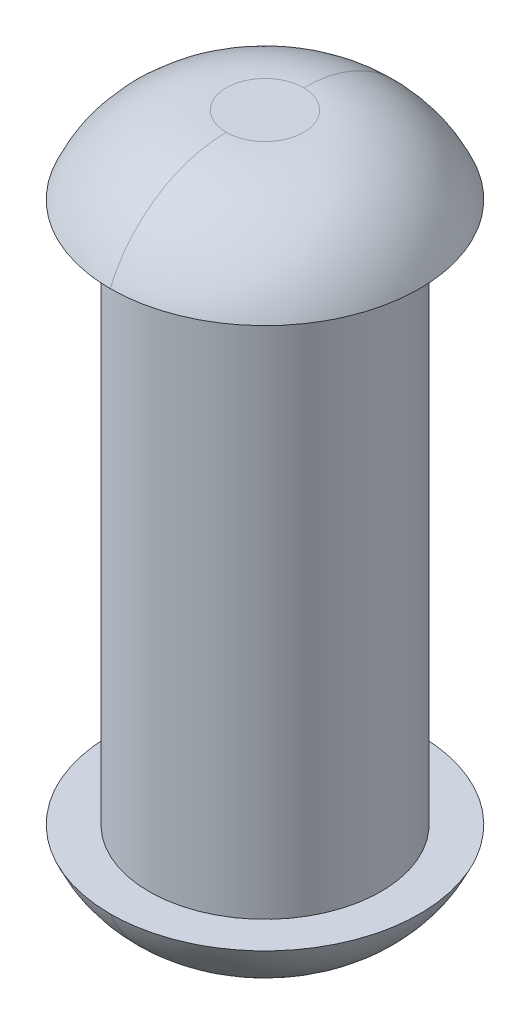
ISO-10303-21;
HEADER;
FILE_DESCRIPTION(('STEP AP214'),'2;1');
FILE_NAME('part.step','',(''),(''),'','','');
FILE_SCHEMA(('AUTOMOTIVE_DESIGN { 1 0 10303 214 1 1 1 1 }'));
ENDSEC;
DATA;
#1=APPLICATION_CONTEXT('core data for automotive mechanical design processes');
#2=APPLICATION_PROTOCOL_DEFINITION('international standard','automotive_design',2000,#1);
#3=PRODUCT_CONTEXT('',#1,'mechanical');
#4=PRODUCT('Part','Part','',(#3));
#5=PRODUCT_RELATED_PRODUCT_CATEGORY('part','',(#4));
#6=PRODUCT_DEFINITION_FORMATION('','',#4);
#7=PRODUCT_DEFINITION_CONTEXT('part definition',#1,'design');
#8=PRODUCT_DEFINITION('design','',#6,#7);
#9=PRODUCT_DEFINITION_SHAPE('','',#8);
#10=(LENGTH_UNIT() NAMED_UNIT(*) SI_UNIT(.MILLI.,.METRE.));
#11=(NAMED_UNIT(*) PLANE_ANGLE_UNIT() SI_UNIT($,.RADIAN.));
#12=(NAMED_UNIT(*) SI_UNIT($,.STERADIAN.) SOLID_ANGLE_UNIT());
#13=UNCERTAINTY_MEASURE_WITH_UNIT(LENGTH_MEASURE(1.E-05),#10,'distance_accuracy_value','');
#14=(GEOMETRIC_REPRESENTATION_CONTEXT(3) GLOBAL_UNCERTAINTY_ASSIGNED_CONTEXT((#13)) GLOBAL_UNIT_ASSIGNED_CONTEXT((#10,
#11,#12)) REPRESENTATION_CONTEXT('',''));
#15=CARTESIAN_POINT('',(0.,0.,0.));
#16=DIRECTION('',(0.,0.,1.));
#17=DIRECTION('',(1.,0.,0.));
#18=AXIS2_PLACEMENT_3D('',#15,#16,#17);
#19=CARTESIAN_POINT('',(-0.506,4.5,0.506));
#20=DIRECTION('',(0.,-1.,0.));
#21=DIRECTION('',(0.,0.,-1.));
#22=AXIS2_PLACEMENT_3D('',#19,#20,#21);
#23=PLANE('',#22);
#24=CARTESIAN_POINT('',(0.,4.5,0.500000000000116));
#25=CARTESIAN_POINT('',(-1.00000000000023,4.5,0.500000000000115));
#26=CARTESIAN_POINT('',(-1.00000000000023,4.5,-0.500000000000115));
#27=CARTESIAN_POINT('',(0.,4.5,-0.500000000000116));
#28=(BOUNDED_CURVE() B_SPLINE_CURVE(3,(#24,#25,#26,#27),.UNSPECIFIED.,.F.,
.F.) B_SPLINE_CURVE_WITH_KNOTS((4,4),(0.,1.),
.UNSPECIFIED.) CURVE() GEOMETRIC_REPRESENTATION_ITEM() RATIONAL_B_SPLINE_CURVE((0.999999999999978,
0.333333333333326,0.333333333333326,0.999999999999978)) REPRESENTATION_ITEM(''));
#29=CARTESIAN_POINT('',(0.,4.5,0.4999999999008));
#30=VERTEX_POINT('',#29);
#31=CARTESIAN_POINT('',(0.,4.5,-0.4999999999008));
#32=VERTEX_POINT('',#31);
#33=EDGE_CURVE('E70',#30,#32,#28,.T.);
#34=ORIENTED_EDGE('',*,*,#33,.F.);
#35=CARTESIAN_POINT('',(0.,4.5,-0.500000000000116));
#36=CARTESIAN_POINT('',(1.00000000000023,4.5,-0.500000000000115));
#37=CARTESIAN_POINT('',(1.00000000000023,4.5,0.500000000000115));
#38=CARTESIAN_POINT('',(0.,4.5,0.500000000000116));
#39=(BOUNDED_CURVE() B_SPLINE_CURVE(3,(#35,#36,#37,#38),.UNSPECIFIED.,.F.,
.F.) B_SPLINE_CURVE_WITH_KNOTS((4,4),(0.,1.),
.UNSPECIFIED.) CURVE() GEOMETRIC_REPRESENTATION_ITEM() RATIONAL_B_SPLINE_CURVE((0.999999999999978,
0.333333333333326,0.333333333333326,0.999999999999978)) REPRESENTATION_ITEM(''));
#40=EDGE_CURVE('E74',#32,#30,#39,.T.);
#41=ORIENTED_EDGE('',*,*,#40,.F.);
#42=EDGE_LOOP('',(#34,#41));
#43=FACE_BOUND('',#42,.T.);
#44=ADVANCED_FACE('F17',(#43),#23,.F.);
#45=CARTESIAN_POINT('',(-0.506,-4.5,-0.506));
#46=DIRECTION('',(0.,1.,0.));
#47=DIRECTION('',(0.,0.,1.));
#48=AXIS2_PLACEMENT_3D('',#45,#46,#47);
#49=PLANE('',#48);
#50=CARTESIAN_POINT('',(0.,-4.5,-0.500000000000116));
#51=CARTESIAN_POINT('',(-1.00000000000023,-4.5,-0.500000000000116));
#52=CARTESIAN_POINT('',(-1.00000000000023,-4.5,0.500000000000116));
#53=CARTESIAN_POINT('',(0.,-4.5,0.500000000000116));
#54=(BOUNDED_CURVE() B_SPLINE_CURVE(3,(#50,#51,#52,#53),.UNSPECIFIED.,.F.,
.F.) B_SPLINE_CURVE_WITH_KNOTS((4,4),(0.,1.),
.UNSPECIFIED.) CURVE() GEOMETRIC_REPRESENTATION_ITEM() RATIONAL_B_SPLINE_CURVE((0.999999999999978,
0.333333333333326,0.333333333333326,0.999999999999978)) REPRESENTATION_ITEM(''));
#55=CARTESIAN_POINT('',(0.,-4.5,-0.4999999999008));
#56=VERTEX_POINT('',#55);
#57=CARTESIAN_POINT('',(0.,-4.5,0.4999999999008));
#58=VERTEX_POINT('',#57);
#59=EDGE_CURVE('E61',#56,#58,#54,.T.);
#60=ORIENTED_EDGE('',*,*,#59,.F.);
#61=CARTESIAN_POINT('',(0.,-4.5,0.500000000000116));
#62=CARTESIAN_POINT('',(1.00000000000023,-4.5,0.500000000000116));
#63=CARTESIAN_POINT('',(1.00000000000023,-4.5,-0.500000000000116));
#64=CARTESIAN_POINT('',(0.,-4.5,-0.500000000000116));
#65=(BOUNDED_CURVE() B_SPLINE_CURVE(3,(#61,#62,#63,#64),.UNSPECIFIED.,.F.,
.F.) B_SPLINE_CURVE_WITH_KNOTS((4,4),(0.,1.),
.UNSPECIFIED.) CURVE() GEOMETRIC_REPRESENTATION_ITEM() RATIONAL_B_SPLINE_CURVE((0.999999999999978,
0.333333333333326,0.333333333333326,0.999999999999978)) REPRESENTATION_ITEM(''));
#66=EDGE_CURVE('E191',#58,#56,#65,.T.);
#67=ORIENTED_EDGE('',*,*,#66,.F.);
#68=EDGE_LOOP('',(#60,#67));
#69=FACE_BOUND('',#68,.T.);
#70=ADVANCED_FACE('F138',(#69),#49,.F.);
#71=CARTESIAN_POINT('',(0.,4.5,-0.5));
#72=CARTESIAN_POINT('',(-1.,4.5,-0.5));
#73=CARTESIAN_POINT('',(-1.,4.5,0.5));
#74=CARTESIAN_POINT('',(0.,4.5,0.5));
#75=CARTESIAN_POINT('',(0.,4.5,-1.176692031));
#76=CARTESIAN_POINT('',(-2.353384062,4.5,-1.176692031));
#77=CARTESIAN_POINT('',(-2.353384062,4.5,1.176692031));
#78=CARTESIAN_POINT('',(0.,4.5,1.176692031));
#79=CARTESIAN_POINT('',(0.,4.124638798,-1.739733834));
#80=CARTESIAN_POINT('',(-3.479467669,4.124638798,-1.739733834));
#81=CARTESIAN_POINT('',(-3.479467669,4.124638798,1.739733834));
#82=CARTESIAN_POINT('',(0.,4.124638798,1.739733834));
#83=CARTESIAN_POINT('',(0.,3.5,-2.));
#84=CARTESIAN_POINT('',(-4.,3.5,-2.));
#85=CARTESIAN_POINT('',(-4.,3.5,2.));
#86=CARTESIAN_POINT('',(0.,3.5,2.));
#87=(BOUNDED_SURFACE() B_SPLINE_SURFACE(3,3,((#71,#72,#73,#74),(#75,#76,#77,#78),(#79,#80,#81,
#82),(#83,#84,#85,#86)),.UNSPECIFIED.,.F.,.F.,.F.) B_SPLINE_SURFACE_WITH_KNOTS((4,4),(4,4),(0.,
1.),(0.,1.),.UNSPECIFIED.) GEOMETRIC_REPRESENTATION_ITEM() RATIONAL_B_SPLINE_SURFACE(((1.,
0.333333333333333,0.333333333333333,1.),(0.888033529558563,0.296011176519521,0.296011176519521,
0.888033529558563),(0.888033529558563,0.296011176519521,0.296011176519521,0.888033529558563),
(1.,0.333333333333333,0.333333333333333,1.))) REPRESENTATION_ITEM('') SURFACE());
#88=CARTESIAN_POINT('',(0.,4.5,0.5));
#89=CARTESIAN_POINT('',(0.,4.5,1.176692031));
#90=CARTESIAN_POINT('',(0.,4.124638798,1.739733834));
#91=CARTESIAN_POINT('',(0.,3.5,2.));
#92=(BOUNDED_CURVE() B_SPLINE_CURVE(3,(#88,#89,#90,#91),.UNSPECIFIED.,.F.,
.F.) B_SPLINE_CURVE_WITH_KNOTS((4,4),(0.,1.),
.UNSPECIFIED.) CURVE() GEOMETRIC_REPRESENTATION_ITEM() RATIONAL_B_SPLINE_CURVE((1.,
0.888033529558563,0.888033529558563,1.)) REPRESENTATION_ITEM(''));
#93=CARTESIAN_POINT('',(0.,3.5,2.));
#94=VERTEX_POINT('',#93);
#95=EDGE_CURVE('E80',#30,#94,#92,.T.);
#96=CARTESIAN_POINT('',(0.,4.5,-0.5));
#97=CARTESIAN_POINT('',(0.,4.5,-1.176692031));
#98=CARTESIAN_POINT('',(0.,4.124638798,-1.739733834));
#99=CARTESIAN_POINT('',(0.,3.5,-2.));
#100=(BOUNDED_CURVE() B_SPLINE_CURVE(3,(#96,#97,#98,#99),.UNSPECIFIED.,.F.,
.F.) B_SPLINE_CURVE_WITH_KNOTS((4,4),(0.,1.),
.UNSPECIFIED.) CURVE() GEOMETRIC_REPRESENTATION_ITEM() RATIONAL_B_SPLINE_CURVE((1.,
0.888033529558563,0.888033529558563,1.)) REPRESENTATION_ITEM(''));
#101=CARTESIAN_POINT('',(0.,3.5,-2.));
#102=VERTEX_POINT('',#101);
#103=EDGE_CURVE('E53',#102,#32,#100,.F.);
#104=CARTESIAN_POINT('',(0.,3.5,-2.));
#105=CARTESIAN_POINT('',(-0.0562680229619233,3.5,-1.99999962641447));
#106=CARTESIAN_POINT('',(-0.112509087930597,3.5,-1.99762394300518));
#107=CARTESIAN_POINT('',(-0.224588791283825,3.5,-1.9881463739492));
#108=CARTESIAN_POINT('',(-0.28042744880788,3.5,-1.98104471460144));
#109=CARTESIAN_POINT('',(-0.446648063709757,3.5,-1.95271723958908));
#110=CARTESIAN_POINT('',(-0.555916554788709,3.5,-1.92446874657418));
#111=CARTESIAN_POINT('',(-0.76815506824914,3.5,-1.85002914799462));
#112=CARTESIAN_POINT('',(-0.871122142729098,3.5,-1.80382971785695));
#113=CARTESIAN_POINT('',(-1.06783350824989,3.5,-1.69480587148286));
#114=CARTESIAN_POINT('',(-1.16157960622734,3.5,-1.63198472136682));
#115=CARTESIAN_POINT('',(-1.33719357958562,3.5,-1.49149611993653));
#116=CARTESIAN_POINT('',(-1.41906119303309,3.5,-1.41382834132565));
#117=CARTESIAN_POINT('',(-1.56860880173396,3.5,-1.24583855555912));
#118=CARTESIAN_POINT('',(-1.63628663443956,3.5,-1.15551462307744));
#119=CARTESIAN_POINT('',(-1.75551336645388,3.5,-0.964790249798284));
#120=CARTESIAN_POINT('',(-1.80706297764236,3.5,-0.86439025400421));
#121=CARTESIAN_POINT('',(-1.89257162478123,3.5,-0.656367388949255));
#122=CARTESIAN_POINT('',(-1.92653178597954,3.5,-0.548744982224534));
#123=CARTESIAN_POINT('',(-1.97590271771947,3.5,-0.329323889979721));
#124=CARTESIAN_POINT('',(-1.99131310813408,3.5,-0.217525118924825));
#125=CARTESIAN_POINT('',(-2.00314687524351,3.5,0.0070745517049324));
#126=CARTESIAN_POINT('',(-1.99956981521806,3.5,0.119875474270177));
#127=CARTESIAN_POINT('',(-1.97352584666787,3.5,0.343277698620541));
#128=CARTESIAN_POINT('',(-1.95105912541404,3.5,0.45387902220122));
#129=CARTESIAN_POINT('',(-1.88788698181247,3.5,0.669728020212936));
#130=CARTESIAN_POINT('',(-1.84718161732594,3.5,0.774975711626934));
#131=CARTESIAN_POINT('',(-1.74863777661584,3.5,0.977189487563662));
#132=CARTESIAN_POINT('',(-1.69079885135884,3.5,1.07415535495196));
#133=CARTESIAN_POINT('',(-1.59254679176868,3.5,1.21118381531814));
#134=CARTESIAN_POINT('',(-1.55787326470221,3.5,1.25546374327093));
#135=CARTESIAN_POINT('',(-1.48488999924051,3.5,1.34099378976153));
#136=CARTESIAN_POINT('',(-1.44657678398915,3.5,1.38224094312319));
#137=CARTESIAN_POINT('',(-1.32666910931567,3.5,1.50085475444602));
#138=CARTESIAN_POINT('',(-1.2400183877163,3.5,1.57321655880106));
#139=CARTESIAN_POINT('',(-1.05578606563579,3.5,1.7023417008121));
#140=CARTESIAN_POINT('',(-0.958204881083522,3.5,1.75910563171886));
#141=CARTESIAN_POINT('',(-0.80577215545657,3.5,1.83136904197552));
#142=CARTESIAN_POINT('',(-0.753894007216332,3.5,1.85332586226793));
#143=CARTESIAN_POINT('',(-0.648500919330627,3.5,1.89277724350991));
#144=CARTESIAN_POINT('',(-0.594987344997411,3.5,1.91027541856335));
#145=CARTESIAN_POINT('',(-0.48673393323535,3.5,1.94068278370897));
#146=CARTESIAN_POINT('',(-0.431995352103913,3.5,1.95359646502991));
#147=CARTESIAN_POINT('',(-0.321635163360164,3.5,1.97476719522395));
#148=CARTESIAN_POINT('',(-0.266013819318915,3.5,1.98302560811863));
#149=CARTESIAN_POINT('',(-0.175226234050914,3.5,1.99261890883154));
#150=CARTESIAN_POINT('',(-0.140205275145586,3.5,1.99538857922048));
#151=CARTESIAN_POINT('',(-0.0701241102824074,3.5,1.99907778719133));
#152=CARTESIAN_POINT('',(-0.0350640649155604,3.5,2.0000003757604));
#153=CARTESIAN_POINT('',(0.,3.5,2.));
#154=B_SPLINE_CURVE_WITH_KNOTS('',3,(#104,#105,#106,#107,#108,#109,#110,#111,#112,#113,#114,
#115,#116,#117,#118,#119,#120,#121,#122,#123,#124,#125,#126,#127,#128,#129,#130,#131,#132,#133,
#134,#135,#136,#137,#138,#139,#140,#141,#142,#143,#144,#145,#146,#147,#148,#149,#150,#151,#152,
#153),.UNSPECIFIED.,.F.,.F.,(4,2,2,2,2,2,2,2,2,2,2,2,2,2,2,2,2,2,2,2,2,2,2,2,4),(0.,
0.168700384984718,0.337392692490236,0.674238578630679,1.01124086057954,1.34817697166002,
1.6851205114153,2.02211536469862,2.35909534134667,2.69605375774872,3.03301907907773,
3.36999215080096,3.70696188183357,4.04393054385352,4.38090803787167,4.54945707455141,
4.71816877054622,5.05514437623787,5.39210716359791,5.56093987110553,5.72963528711621,
5.89816498054248,6.06664526805524,6.1719914868906,6.27716355208919),.UNSPECIFIED.);
#155=EDGE_CURVE('E22',#102,#94,#154,.T.);
#156=ORIENTED_EDGE('',*,*,#95,.F.);
#157=ORIENTED_EDGE('',*,*,#33,.T.);
#158=ORIENTED_EDGE('',*,*,#103,.F.);
#159=ORIENTED_EDGE('',*,*,#155,.T.);
#160=EDGE_LOOP('',(#156,#157,#158,#159));
#161=FACE_BOUND('',#160,.T.);
#162=ADVANCED_FACE('F81',(#161),#87,.T.);
#163=CARTESIAN_POINT('',(0.,4.5,0.5));
#164=CARTESIAN_POINT('',(1.,4.5,0.5));
#165=CARTESIAN_POINT('',(1.,4.5,-0.5));
#166=CARTESIAN_POINT('',(0.,4.5,-0.5));
#167=CARTESIAN_POINT('',(0.,4.5,1.176692031));
#168=CARTESIAN_POINT('',(2.353384062,4.5,1.176692031));
#169=CARTESIAN_POINT('',(2.353384062,4.5,-1.176692031));
#170=CARTESIAN_POINT('',(0.,4.5,-1.176692031));
#171=CARTESIAN_POINT('',(0.,4.124638798,1.739733834));
#172=CARTESIAN_POINT('',(3.479467669,4.124638798,1.739733834));
#173=CARTESIAN_POINT('',(3.479467669,4.124638798,-1.739733834));
#174=CARTESIAN_POINT('',(0.,4.124638798,-1.739733834));
#175=CARTESIAN_POINT('',(0.,3.5,2.));
#176=CARTESIAN_POINT('',(4.,3.5,2.));
#177=CARTESIAN_POINT('',(4.,3.5,-2.));
#178=CARTESIAN_POINT('',(0.,3.5,-2.));
#179=(BOUNDED_SURFACE() B_SPLINE_SURFACE(3,3,((#163,#164,#165,#166),(#167,#168,#169,#170),(#171,
#172,#173,#174),(#175,#176,#177,#178)),.UNSPECIFIED.,.F.,.F.,
.F.) B_SPLINE_SURFACE_WITH_KNOTS((4,4),(4,4),(0.,1.),(0.,1.),
.UNSPECIFIED.) GEOMETRIC_REPRESENTATION_ITEM() RATIONAL_B_SPLINE_SURFACE(((1.,0.333333333333333,
0.333333333333333,1.),(0.888033529558563,0.296011176519521,0.296011176519521,0.888033529558563),
(0.888033529558563,0.296011176519521,0.296011176519521,0.888033529558563),(1.,0.333333333333333,
0.333333333333333,1.))) REPRESENTATION_ITEM('') SURFACE());
#180=CARTESIAN_POINT('',(0.,3.5,2.));
#181=CARTESIAN_POINT('',(0.0562680229619233,3.5,1.99999962641447));
#182=CARTESIAN_POINT('',(0.112509087930597,3.5,1.99762394300518));
#183=CARTESIAN_POINT('',(0.224588791283825,3.5,1.9881463739492));
#184=CARTESIAN_POINT('',(0.28042744880788,3.5,1.98104471460144));
#185=CARTESIAN_POINT('',(0.446648063709757,3.5,1.95271723958908));
#186=CARTESIAN_POINT('',(0.555916554788709,3.5,1.92446874657418));
#187=CARTESIAN_POINT('',(0.76815506824914,3.5,1.85002914799462));
#188=CARTESIAN_POINT('',(0.871122142729098,3.5,1.80382971785695));
#189=CARTESIAN_POINT('',(1.06783350824989,3.5,1.69480587148286));
#190=CARTESIAN_POINT('',(1.16157960622734,3.5,1.63198472136682));
#191=CARTESIAN_POINT('',(1.33719357958562,3.5,1.49149611993653));
#192=CARTESIAN_POINT('',(1.41906119303309,3.5,1.41382834132565));
#193=CARTESIAN_POINT('',(1.56860880173396,3.5,1.24583855555912));
#194=CARTESIAN_POINT('',(1.63628663443956,3.5,1.15551462307744));
#195=CARTESIAN_POINT('',(1.75551336645388,3.5,0.964790249798284));
#196=CARTESIAN_POINT('',(1.80706297764236,3.5,0.86439025400421));
#197=CARTESIAN_POINT('',(1.89257162478123,3.5,0.656367388949255));
#198=CARTESIAN_POINT('',(1.92653178597954,3.5,0.548744982224534));
#199=CARTESIAN_POINT('',(1.97590271771947,3.5,0.329323889979721));
#200=CARTESIAN_POINT('',(1.99131310813408,3.5,0.217525118924825));
#201=CARTESIAN_POINT('',(2.00314687524351,3.5,-0.0070745517049324));
#202=CARTESIAN_POINT('',(1.99956981521806,3.5,-0.119875474270177));
#203=CARTESIAN_POINT('',(1.97352584666787,3.5,-0.343277698620541));
#204=CARTESIAN_POINT('',(1.95105912541404,3.5,-0.45387902220122));
#205=CARTESIAN_POINT('',(1.88788698181247,3.5,-0.669728020212936));
#206=CARTESIAN_POINT('',(1.84718161732594,3.5,-0.774975711626934));
#207=CARTESIAN_POINT('',(1.74863777661584,3.5,-0.977189487563662));
#208=CARTESIAN_POINT('',(1.69079885135884,3.5,-1.07415535495196));
#209=CARTESIAN_POINT('',(1.59254679176868,3.5,-1.21118381531814));
#210=CARTESIAN_POINT('',(1.55787326470221,3.5,-1.25546374327093));
#211=CARTESIAN_POINT('',(1.48488999924051,3.5,-1.34099378976153));
#212=CARTESIAN_POINT('',(1.44657678398915,3.5,-1.38224094312319));
#213=CARTESIAN_POINT('',(1.32666910931567,3.5,-1.50085475444602));
#214=CARTESIAN_POINT('',(1.2400183877163,3.5,-1.57321655880106));
#215=CARTESIAN_POINT('',(1.05578606563579,3.5,-1.7023417008121));
#216=CARTESIAN_POINT('',(0.958204881083522,3.5,-1.75910563171886));
#217=CARTESIAN_POINT('',(0.80577215545657,3.5,-1.83136904197552));
#218=CARTESIAN_POINT('',(0.753894007216332,3.5,-1.85332586226793));
#219=CARTESIAN_POINT('',(0.648500919330627,3.5,-1.89277724350991));
#220=CARTESIAN_POINT('',(0.594987344997411,3.5,-1.91027541856335));
#221=CARTESIAN_POINT('',(0.48673393323535,3.5,-1.94068278370897));
#222=CARTESIAN_POINT('',(0.431995352103913,3.5,-1.95359646502991));
#223=CARTESIAN_POINT('',(0.321635163360164,3.5,-1.97476719522395));
#224=CARTESIAN_POINT('',(0.266013819318915,3.5,-1.98302560811863));
#225=CARTESIAN_POINT('',(0.175226234050914,3.5,-1.99261890883154));
#226=CARTESIAN_POINT('',(0.140205275145586,3.5,-1.99538857922048));
#227=CARTESIAN_POINT('',(0.0701241102824074,3.5,-1.99907778719133));
#228=CARTESIAN_POINT('',(0.0350640649155604,3.5,-2.0000003757604));
#229=CARTESIAN_POINT('',(0.,3.5,-2.));
#230=B_SPLINE_CURVE_WITH_KNOTS('',3,(#180,#181,#182,#183,#184,#185,#186,#187,#188,#189,#190,
#191,#192,#193,#194,#195,#196,#197,#198,#199,#200,#201,#202,#203,#204,#205,#206,#207,#208,#209,
#210,#211,#212,#213,#214,#215,#216,#217,#218,#219,#220,#221,#222,#223,#224,#225,#226,#227,#228,
#229),.UNSPECIFIED.,.F.,.F.,(4,2,2,2,2,2,2,2,2,2,2,2,2,2,2,2,2,2,2,2,2,2,2,2,4),(0.,
0.168700384984718,0.337392692490236,0.674238578630679,1.01124086057954,1.34817697166002,
1.6851205114153,2.02211536469862,2.35909534134667,2.69605375774872,3.03301907907773,
3.36999215080096,3.70696188183357,4.04393054385352,4.38090803787167,4.54945707455141,
4.71816877054622,5.05514437623787,5.39210716359791,5.56093987110553,5.72963528711621,
5.89816498054248,6.06664526805524,6.1719914868906,6.27716355208919),.UNSPECIFIED.);
#231=EDGE_CURVE('E121',#94,#102,#230,.T.);
#232=ORIENTED_EDGE('',*,*,#40,.T.);
#233=ORIENTED_EDGE('',*,*,#95,.T.);
#234=ORIENTED_EDGE('',*,*,#231,.T.);
#235=ORIENTED_EDGE('',*,*,#103,.T.);
#236=EDGE_LOOP('',(#232,#233,#234,#235));
#237=FACE_BOUND('',#236,.T.);
#238=ADVANCED_FACE('F87',(#237),#179,.T.);
#239=CARTESIAN_POINT('',(0.,-3.5,-2.));
#240=CARTESIAN_POINT('',(-4.,-3.5,-2.));
#241=CARTESIAN_POINT('',(-4.,-3.5,2.));
#242=CARTESIAN_POINT('',(0.,-3.5,2.));
#243=CARTESIAN_POINT('',(0.,-4.124638798,-1.739733834));
#244=CARTESIAN_POINT('',(-3.479467669,-4.124638798,-1.739733834));
#245=CARTESIAN_POINT('',(-3.479467669,-4.124638798,1.739733834));
#246=CARTESIAN_POINT('',(0.,-4.124638798,1.739733834));
#247=CARTESIAN_POINT('',(0.,-4.5,-1.176692031));
#248=CARTESIAN_POINT('',(-2.353384062,-4.5,-1.176692031));
#249=CARTESIAN_POINT('',(-2.353384062,-4.5,1.176692031));
#250=CARTESIAN_POINT('',(0.,-4.5,1.176692031));
#251=CARTESIAN_POINT('',(0.,-4.5,-0.5));
#252=CARTESIAN_POINT('',(-1.,-4.5,-0.5));
#253=CARTESIAN_POINT('',(-1.,-4.5,0.5));
#254=CARTESIAN_POINT('',(0.,-4.5,0.5));
#255=(BOUNDED_SURFACE() B_SPLINE_SURFACE(3,3,((#239,#240,#241,#242),(#243,#244,#245,#246),(#247,
#248,#249,#250),(#251,#252,#253,#254)),.UNSPECIFIED.,.F.,.F.,
.F.) B_SPLINE_SURFACE_WITH_KNOTS((4,4),(4,4),(0.,1.),(0.,1.),
.UNSPECIFIED.) GEOMETRIC_REPRESENTATION_ITEM() RATIONAL_B_SPLINE_SURFACE(((1.,0.333333333333333,
0.333333333333333,1.),(0.888033529558563,0.296011176519521,0.296011176519521,0.888033529558563),
(0.888033529558563,0.296011176519521,0.296011176519521,0.888033529558563),(1.,0.333333333333333,
0.333333333333333,1.))) REPRESENTATION_ITEM('') SURFACE());
#256=CARTESIAN_POINT('',(0.,-3.5,2.));
#257=CARTESIAN_POINT('',(0.,-4.124638798,1.739733834));
#258=CARTESIAN_POINT('',(0.,-4.5,1.176692031));
#259=CARTESIAN_POINT('',(0.,-4.5,0.5));
#260=(BOUNDED_CURVE() B_SPLINE_CURVE(3,(#256,#257,#258,#259),.UNSPECIFIED.,.F.,
.F.) B_SPLINE_CURVE_WITH_KNOTS((4,4),(0.,1.),
.UNSPECIFIED.) CURVE() GEOMETRIC_REPRESENTATION_ITEM() RATIONAL_B_SPLINE_CURVE((1.,
0.888033529558563,0.888033529558563,1.)) REPRESENTATION_ITEM(''));
#261=CARTESIAN_POINT('',(0.,-3.5,2.));
#262=VERTEX_POINT('',#261);
#263=EDGE_CURVE('E189',#262,#58,#260,.T.);
#264=CARTESIAN_POINT('',(0.,-3.5,2.));
#265=CARTESIAN_POINT('',(-0.0562680229619232,-3.5,1.99999962641447));
#266=CARTESIAN_POINT('',(-0.112509087930596,-3.5,1.99762394300518));
#267=CARTESIAN_POINT('',(-0.224588791283825,-3.5,1.9881463739492));
#268=CARTESIAN_POINT('',(-0.280427448807879,-3.5,1.98104471460144));
#269=CARTESIAN_POINT('',(-0.446648063709756,-3.5,1.95271723958908));
#270=CARTESIAN_POINT('',(-0.555916554788707,-3.5,1.92446874657419));
#271=CARTESIAN_POINT('',(-0.768155068249138,-3.5,1.85002914799462));
#272=CARTESIAN_POINT('',(-0.871122142729096,-3.5,1.80382971785696));
#273=CARTESIAN_POINT('',(-1.06783350824988,-3.5,1.69480587148286));
#274=CARTESIAN_POINT('',(-1.16157960622734,-3.5,1.63198472136682));
#275=CARTESIAN_POINT('',(-1.33719357958562,-3.5,1.49149611993653));
#276=CARTESIAN_POINT('',(-1.41906119303309,-3.5,1.41382834132565));
#277=CARTESIAN_POINT('',(-1.56860880173396,-3.5,1.24583855555913));
#278=CARTESIAN_POINT('',(-1.63628663443956,-3.5,1.15551462307745));
#279=CARTESIAN_POINT('',(-1.75551336645388,-3.5,0.964790249798287));
#280=CARTESIAN_POINT('',(-1.80706297764236,-3.5,0.864390254004213));
#281=CARTESIAN_POINT('',(-1.89257162478123,-3.5,0.656367388949258));
#282=CARTESIAN_POINT('',(-1.92653178597954,-3.5,0.548744982224536));
#283=CARTESIAN_POINT('',(-1.97590271771947,-3.5,0.329323889979724));
#284=CARTESIAN_POINT('',(-1.99131310813407,-3.5,0.217525118924829));
#285=CARTESIAN_POINT('',(-2.00314687524351,-3.5,-0.00707455170492855));
#286=CARTESIAN_POINT('',(-1.99956981521806,-3.5,-0.119875474270173));
#287=CARTESIAN_POINT('',(-1.97352584666787,-3.5,-0.343277698620537));
#288=CARTESIAN_POINT('',(-1.95105912541404,-3.5,-0.453879022201216));
#289=CARTESIAN_POINT('',(-1.88788698181247,-3.5,-0.669728020212933));
#290=CARTESIAN_POINT('',(-1.84718161732595,-3.5,-0.774975711626931));
#291=CARTESIAN_POINT('',(-1.74863777661584,-3.5,-0.97718948756366));
#292=CARTESIAN_POINT('',(-1.69079885135884,-3.5,-1.07415535495195));
#293=CARTESIAN_POINT('',(-1.59254679176868,-3.5,-1.21118381531814));
#294=CARTESIAN_POINT('',(-1.55787326470221,-3.5,-1.25546374327093));
#295=CARTESIAN_POINT('',(-1.48488999924051,-3.5,-1.34099378976153));
#296=CARTESIAN_POINT('',(-1.44657678398915,-3.5,-1.38224094312319));
#297=CARTESIAN_POINT('',(-1.32666910931567,-3.5,-1.50085475444602));
#298=CARTESIAN_POINT('',(-1.2400183877163,-3.5,-1.57321655880106));
#299=CARTESIAN_POINT('',(-1.05578606563579,-3.5,-1.7023417008121));
#300=CARTESIAN_POINT('',(-0.958204881083525,-3.5,-1.75910563171886));
#301=CARTESIAN_POINT('',(-0.805772155456574,-3.5,-1.83136904197552));
#302=CARTESIAN_POINT('',(-0.753894007216335,-3.5,-1.85332586226793));
#303=CARTESIAN_POINT('',(-0.648500919330631,-3.5,-1.8927772435099));
#304=CARTESIAN_POINT('',(-0.594987344997414,-3.5,-1.91027541856335));
#305=CARTESIAN_POINT('',(-0.486733933235353,-3.5,-1.94068278370897));
#306=CARTESIAN_POINT('',(-0.431995352103917,-3.5,-1.95359646502991));
#307=CARTESIAN_POINT('',(-0.321635163360168,-3.5,-1.97476719522395));
#308=CARTESIAN_POINT('',(-0.266013819318919,-3.5,-1.98302560811863));
#309=CARTESIAN_POINT('',(-0.175226234050917,-3.5,-1.99261890883154));
#310=CARTESIAN_POINT('',(-0.140205275145588,-3.5,-1.99538857922048));
#311=CARTESIAN_POINT('',(-0.0701241102824087,-3.5,-1.99907778719134));
#312=CARTESIAN_POINT('',(-0.0350640649155611,-3.5,-2.0000003757604));
#313=CARTESIAN_POINT('',(0.,-3.5,-2.));
#314=B_SPLINE_CURVE_WITH_KNOTS('',3,(#264,#265,#266,#267,#268,#269,#270,#271,#272,#273,#274,
#275,#276,#277,#278,#279,#280,#281,#282,#283,#284,#285,#286,#287,#288,#289,#290,#291,#292,#293,
#294,#295,#296,#297,#298,#299,#300,#301,#302,#303,#304,#305,#306,#307,#308,#309,#310,#311,#312,
#313),.UNSPECIFIED.,.F.,.F.,(4,2,2,2,2,2,2,2,2,2,2,2,2,2,2,2,2,2,2,2,2,2,2,2,4),(0.,
0.168700384984718,0.337392692490235,0.674238578630677,1.01124086057953,1.34817697166002,
1.6851205114153,2.02211536469862,2.35909534134666,2.69605375774871,3.03301907907773,
3.36999215080096,3.70696188183357,4.04393054385351,4.38090803787167,4.54945707455141,
4.71816877054622,5.05514437623786,5.3921071635979,5.56093987110553,5.7296352871162,
5.89816498054248,6.06664526805524,6.17199148689059,6.27716355208919),.UNSPECIFIED.);
#315=CARTESIAN_POINT('',(0.,-3.5,-2.));
#316=VERTEX_POINT('',#315);
#317=EDGE_CURVE('E42',#262,#316,#314,.T.);
#318=CARTESIAN_POINT('',(0.,-3.5,-2.));
#319=CARTESIAN_POINT('',(0.,-4.124638798,-1.739733834));
#320=CARTESIAN_POINT('',(0.,-4.5,-1.176692031));
#321=CARTESIAN_POINT('',(0.,-4.5,-0.5));
#322=(BOUNDED_CURVE() B_SPLINE_CURVE(3,(#318,#319,#320,#321),.UNSPECIFIED.,.F.,
.F.) B_SPLINE_CURVE_WITH_KNOTS((4,4),(0.,1.),
.UNSPECIFIED.) CURVE() GEOMETRIC_REPRESENTATION_ITEM() RATIONAL_B_SPLINE_CURVE((1.,
0.888033529558563,0.888033529558563,1.)) REPRESENTATION_ITEM(''));
#323=EDGE_CURVE('E190',#56,#316,#322,.F.);
#324=ORIENTED_EDGE('',*,*,#263,.F.);
#325=ORIENTED_EDGE('',*,*,#317,.T.);
#326=ORIENTED_EDGE('',*,*,#323,.F.);
#327=ORIENTED_EDGE('',*,*,#59,.T.);
#328=EDGE_LOOP('',(#324,#325,#326,#327));
#329=FACE_BOUND('',#328,.T.);
#330=ADVANCED_FACE('F106',(#329),#255,.T.);
#331=CARTESIAN_POINT('',(0.,-3.5,2.));
#332=CARTESIAN_POINT('',(4.,-3.5,2.));
#333=CARTESIAN_POINT('',(4.,-3.5,-2.));
#334=CARTESIAN_POINT('',(0.,-3.5,-2.));
#335=CARTESIAN_POINT('',(0.,-4.124638798,1.739733834));
#336=CARTESIAN_POINT('',(3.479467669,-4.124638798,1.739733834));
#337=CARTESIAN_POINT('',(3.479467669,-4.124638798,-1.739733834));
#338=CARTESIAN_POINT('',(0.,-4.124638798,-1.739733834));
#339=CARTESIAN_POINT('',(0.,-4.5,1.176692031));
#340=CARTESIAN_POINT('',(2.353384062,-4.5,1.176692031));
#341=CARTESIAN_POINT('',(2.353384062,-4.5,-1.176692031));
#342=CARTESIAN_POINT('',(0.,-4.5,-1.176692031));
#343=CARTESIAN_POINT('',(0.,-4.5,0.5));
#344=CARTESIAN_POINT('',(1.,-4.5,0.5));
#345=CARTESIAN_POINT('',(1.,-4.5,-0.5));
#346=CARTESIAN_POINT('',(0.,-4.5,-0.5));
#347=(BOUNDED_SURFACE() B_SPLINE_SURFACE(3,3,((#331,#332,#333,#334),(#335,#336,#337,#338),(#339,
#340,#341,#342),(#343,#344,#345,#346)),.UNSPECIFIED.,.F.,.F.,
.F.) B_SPLINE_SURFACE_WITH_KNOTS((4,4),(4,4),(0.,1.),(0.,1.),
.UNSPECIFIED.) GEOMETRIC_REPRESENTATION_ITEM() RATIONAL_B_SPLINE_SURFACE(((1.,0.333333333333333,
0.333333333333333,1.),(0.888033529558563,0.296011176519521,0.296011176519521,0.888033529558563),
(0.888033529558563,0.296011176519521,0.296011176519521,0.888033529558563),(1.,0.333333333333333,
0.333333333333333,1.))) REPRESENTATION_ITEM('') SURFACE());
#348=CARTESIAN_POINT('',(0.,-3.5,-2.));
#349=CARTESIAN_POINT('',(0.0562680229619232,-3.5,-1.99999962641447));
#350=CARTESIAN_POINT('',(0.112509087930596,-3.5,-1.99762394300518));
#351=CARTESIAN_POINT('',(0.224588791283825,-3.5,-1.9881463739492));
#352=CARTESIAN_POINT('',(0.280427448807879,-3.5,-1.98104471460144));
#353=CARTESIAN_POINT('',(0.446648063709756,-3.5,-1.95271723958908));
#354=CARTESIAN_POINT('',(0.555916554788707,-3.5,-1.92446874657419));
#355=CARTESIAN_POINT('',(0.768155068249138,-3.5,-1.85002914799462));
#356=CARTESIAN_POINT('',(0.871122142729096,-3.5,-1.80382971785696));
#357=CARTESIAN_POINT('',(1.06783350824988,-3.5,-1.69480587148286));
#358=CARTESIAN_POINT('',(1.16157960622734,-3.5,-1.63198472136682));
#359=CARTESIAN_POINT('',(1.33719357958562,-3.5,-1.49149611993653));
#360=CARTESIAN_POINT('',(1.41906119303309,-3.5,-1.41382834132565));
#361=CARTESIAN_POINT('',(1.56860880173396,-3.5,-1.24583855555913));
#362=CARTESIAN_POINT('',(1.63628663443956,-3.5,-1.15551462307745));
#363=CARTESIAN_POINT('',(1.75551336645388,-3.5,-0.964790249798287));
#364=CARTESIAN_POINT('',(1.80706297764236,-3.5,-0.864390254004213));
#365=CARTESIAN_POINT('',(1.89257162478123,-3.5,-0.656367388949258));
#366=CARTESIAN_POINT('',(1.92653178597954,-3.5,-0.548744982224536));
#367=CARTESIAN_POINT('',(1.97590271771947,-3.5,-0.329323889979724));
#368=CARTESIAN_POINT('',(1.99131310813407,-3.5,-0.217525118924829));
#369=CARTESIAN_POINT('',(2.00314687524351,-3.5,0.00707455170492855));
#370=CARTESIAN_POINT('',(1.99956981521806,-3.5,0.119875474270173));
#371=CARTESIAN_POINT('',(1.97352584666787,-3.5,0.343277698620537));
#372=CARTESIAN_POINT('',(1.95105912541404,-3.5,0.453879022201216));
#373=CARTESIAN_POINT('',(1.88788698181247,-3.5,0.669728020212933));
#374=CARTESIAN_POINT('',(1.84718161732595,-3.5,0.774975711626931));
#375=CARTESIAN_POINT('',(1.74863777661584,-3.5,0.97718948756366));
#376=CARTESIAN_POINT('',(1.69079885135884,-3.5,1.07415535495195));
#377=CARTESIAN_POINT('',(1.59254679176868,-3.5,1.21118381531814));
#378=CARTESIAN_POINT('',(1.55787326470221,-3.5,1.25546374327093));
#379=CARTESIAN_POINT('',(1.48488999924051,-3.5,1.34099378976153));
#380=CARTESIAN_POINT('',(1.44657678398915,-3.5,1.38224094312319));
#381=CARTESIAN_POINT('',(1.32666910931567,-3.5,1.50085475444602));
#382=CARTESIAN_POINT('',(1.2400183877163,-3.5,1.57321655880106));
#383=CARTESIAN_POINT('',(1.05578606563579,-3.5,1.7023417008121));
#384=CARTESIAN_POINT('',(0.958204881083525,-3.5,1.75910563171886));
#385=CARTESIAN_POINT('',(0.805772155456574,-3.5,1.83136904197552));
#386=CARTESIAN_POINT('',(0.753894007216335,-3.5,1.85332586226793));
#387=CARTESIAN_POINT('',(0.648500919330631,-3.5,1.8927772435099));
#388=CARTESIAN_POINT('',(0.594987344997414,-3.5,1.91027541856335));
#389=CARTESIAN_POINT('',(0.486733933235353,-3.5,1.94068278370897));
#390=CARTESIAN_POINT('',(0.431995352103917,-3.5,1.95359646502991));
#391=CARTESIAN_POINT('',(0.321635163360168,-3.5,1.97476719522395));
#392=CARTESIAN_POINT('',(0.266013819318919,-3.5,1.98302560811863));
#393=CARTESIAN_POINT('',(0.175226234050917,-3.5,1.99261890883154));
#394=CARTESIAN_POINT('',(0.140205275145588,-3.5,1.99538857922048));
#395=CARTESIAN_POINT('',(0.0701241102824087,-3.5,1.99907778719134));
#396=CARTESIAN_POINT('',(0.0350640649155611,-3.5,2.0000003757604));
#397=CARTESIAN_POINT('',(0.,-3.5,2.));
#398=B_SPLINE_CURVE_WITH_KNOTS('',3,(#348,#349,#350,#351,#352,#353,#354,#355,#356,#357,#358,
#359,#360,#361,#362,#363,#364,#365,#366,#367,#368,#369,#370,#371,#372,#373,#374,#375,#376,#377,
#378,#379,#380,#381,#382,#383,#384,#385,#386,#387,#388,#389,#390,#391,#392,#393,#394,#395,#396,
#397),.UNSPECIFIED.,.F.,.F.,(4,2,2,2,2,2,2,2,2,2,2,2,2,2,2,2,2,2,2,2,2,2,2,2,4),(0.,
0.168700384984718,0.337392692490235,0.674238578630677,1.01124086057953,1.34817697166002,
1.6851205114153,2.02211536469862,2.35909534134666,2.69605375774871,3.03301907907773,
3.36999215080096,3.70696188183357,4.04393054385351,4.38090803787167,4.54945707455141,
4.71816877054622,5.05514437623786,5.3921071635979,5.56093987110553,5.7296352871162,
5.89816498054248,6.06664526805524,6.17199148689059,6.27716355208919),.UNSPECIFIED.);
#399=EDGE_CURVE('E158',#316,#262,#398,.T.);
#400=ORIENTED_EDGE('',*,*,#399,.T.);
#401=ORIENTED_EDGE('',*,*,#263,.T.);
#402=ORIENTED_EDGE('',*,*,#66,.T.);
#403=ORIENTED_EDGE('',*,*,#323,.T.);
#404=EDGE_LOOP('',(#400,#401,#402,#403));
#405=FACE_BOUND('',#404,.T.);
#406=ADVANCED_FACE('F136',(#405),#347,.T.);
#407=CARTESIAN_POINT('',(-2.024,3.5,-2.024));
#408=DIRECTION('',(0.,1.,0.));
#409=DIRECTION('',(0.,0.,1.));
#410=AXIS2_PLACEMENT_3D('',#407,#408,#409);
#411=PLANE('',#410);
#412=CARTESIAN_POINT('',(0.,3.5,0.));
#413=DIRECTION('',(0.,1.,0.));
#414=DIRECTION('',(-1.,0.,0.));
#415=AXIS2_PLACEMENT_3D('',#412,#413,#414);
#416=CIRCLE('',#415,1.5);
#417=CARTESIAN_POINT('',(-1.5,3.5,0.));
#418=VERTEX_POINT('',#417);
#419=EDGE_CURVE('E33',#418,#418,#416,.T.);
#420=ORIENTED_EDGE('',*,*,#419,.T.);
#421=EDGE_LOOP('',(#420));
#422=FACE_BOUND('',#421,.T.);
#423=ORIENTED_EDGE('',*,*,#155,.F.);
#424=ORIENTED_EDGE('',*,*,#231,.F.);
#425=EDGE_LOOP('',(#423,#424));
#426=FACE_BOUND('',#425,.T.);
#427=ADVANCED_FACE('F132',(#422,#426),#411,.F.);
#428=CARTESIAN_POINT('',(-2.024,-3.5,2.024));
#429=DIRECTION('',(0.,-1.,0.));
#430=DIRECTION('',(0.,0.,-1.));
#431=AXIS2_PLACEMENT_3D('',#428,#429,#430);
#432=PLANE('',#431);
#433=CARTESIAN_POINT('',(0.,-3.5,0.));
#434=DIRECTION('',(0.,1.,0.));
#435=DIRECTION('',(-1.,0.,0.));
#436=AXIS2_PLACEMENT_3D('',#433,#434,#435);
#437=CIRCLE('',#436,1.5);
#438=CARTESIAN_POINT('',(-1.5,-3.5,0.));
#439=VERTEX_POINT('',#438);
#440=EDGE_CURVE('E11',#439,#439,#437,.F.);
#441=ORIENTED_EDGE('',*,*,#440,.T.);
#442=EDGE_LOOP('',(#441));
#443=FACE_BOUND('',#442,.T.);
#444=ORIENTED_EDGE('',*,*,#317,.F.);
#445=ORIENTED_EDGE('',*,*,#399,.F.);
#446=EDGE_LOOP('',(#444,#445));
#447=FACE_BOUND('',#446,.T.);
#448=ADVANCED_FACE('F19',(#443,#447),#432,.F.);
#449=CARTESIAN_POINT('',(0.,-3.5,0.));
#450=DIRECTION('',(0.,1.,0.));
#451=DIRECTION('',(-1.,0.,0.));
#452=AXIS2_PLACEMENT_3D('',#449,#450,#451);
#453=CYLINDRICAL_SURFACE('',#452,1.5);
#454=ORIENTED_EDGE('',*,*,#419,.F.);
#455=EDGE_LOOP('',(#454));
#456=FACE_BOUND('',#455,.T.);
#457=ORIENTED_EDGE('',*,*,#440,.F.);
#458=EDGE_LOOP('',(#457));
#459=FACE_BOUND('',#458,.T.);
#460=ADVANCED_FACE('F170',(#456,#459),#453,.T.);
#461=CLOSED_SHELL('',(#44,#70,#162,#238,#330,#406,#427,#448,#460));
#462=MANIFOLD_SOLID_BREP('B1',#461);
#463=ADVANCED_BREP_SHAPE_REPRESENTATION('',(#18,#462),#14);
#464=SHAPE_DEFINITION_REPRESENTATION(#9,#463);
ENDSEC;
END-ISO-10303-21;
